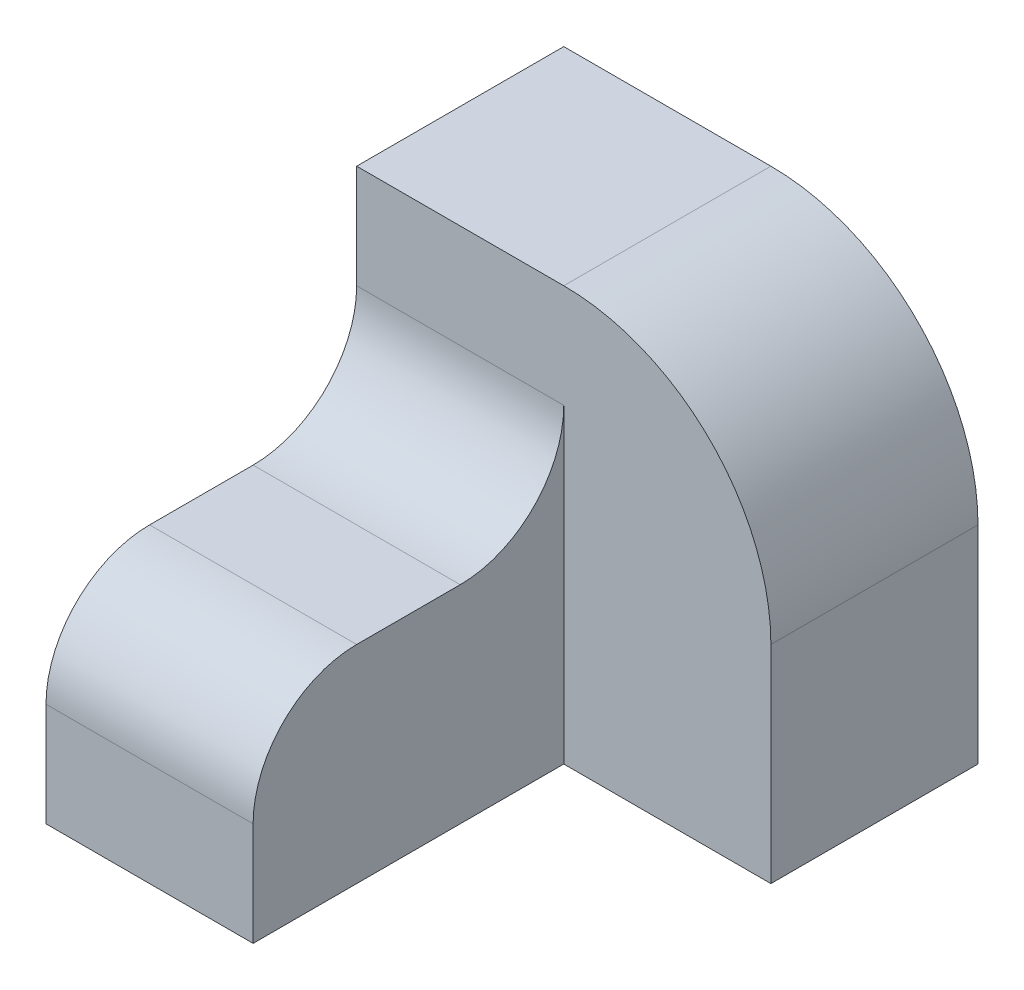
ISO-10303-21;
HEADER;
FILE_DESCRIPTION(('STEP AP214'),'2;1');
FILE_NAME('part.step','',(''),(''),'','','');
FILE_SCHEMA(('AUTOMOTIVE_DESIGN { 1 0 10303 214 1 1 1 1 }'));
ENDSEC;
DATA;
#1=APPLICATION_CONTEXT('core data for automotive mechanical design processes');
#2=APPLICATION_PROTOCOL_DEFINITION('international standard','automotive_design',2000,#1);
#3=PRODUCT_CONTEXT('',#1,'mechanical');
#4=PRODUCT('Part','Part','',(#3));
#5=PRODUCT_RELATED_PRODUCT_CATEGORY('part','',(#4));
#6=PRODUCT_DEFINITION_FORMATION('','',#4);
#7=PRODUCT_DEFINITION_CONTEXT('part definition',#1,'design');
#8=PRODUCT_DEFINITION('design','',#6,#7);
#9=PRODUCT_DEFINITION_SHAPE('','',#8);
#10=(LENGTH_UNIT() NAMED_UNIT(*) SI_UNIT(.MILLI.,.METRE.));
#11=(NAMED_UNIT(*) PLANE_ANGLE_UNIT() SI_UNIT($,.RADIAN.));
#12=(NAMED_UNIT(*) SI_UNIT($,.STERADIAN.) SOLID_ANGLE_UNIT());
#13=UNCERTAINTY_MEASURE_WITH_UNIT(LENGTH_MEASURE(1.E-05),#10,'distance_accuracy_value','');
#14=(GEOMETRIC_REPRESENTATION_CONTEXT(3) GLOBAL_UNCERTAINTY_ASSIGNED_CONTEXT((#13)) GLOBAL_UNIT_ASSIGNED_CONTEXT((#10,
#11,#12)) REPRESENTATION_CONTEXT('',''));
#15=CARTESIAN_POINT('',(0.,0.,0.));
#16=DIRECTION('',(0.,0.,1.));
#17=DIRECTION('',(1.,0.,0.));
#18=AXIS2_PLACEMENT_3D('',#15,#16,#17);
#19=CARTESIAN_POINT('',(20.,-10.,30.));
#20=DIRECTION('',(1.,0.,0.));
#21=DIRECTION('',(0.,0.,-1.));
#22=AXIS2_PLACEMENT_3D('',#19,#20,#21);
#23=PLANE('',#22);
#24=DIRECTION('',(0.,0.,-1.));
#25=VECTOR('',#24,1.);
#26=CARTESIAN_POINT('',(20.,-20.,10.));
#27=LINE('',#26,#25);
#28=CARTESIAN_POINT('',(20.,-20.,40.));
#29=VERTEX_POINT('',#28);
#30=CARTESIAN_POINT('',(20.,-20.,10.));
#31=VERTEX_POINT('',#30);
#32=EDGE_CURVE('E55',#29,#31,#27,.T.);
#33=ORIENTED_EDGE('',*,*,#32,.T.);
#34=DIRECTION('',(0.,1.,0.));
#35=VECTOR('',#34,1.);
#36=CARTESIAN_POINT('',(20.,-20.,10.));
#37=LINE('',#36,#35);
#38=CARTESIAN_POINT('',(20.,10.0000000000001,10.));
#39=VERTEX_POINT('',#38);
#40=EDGE_CURVE('E201',#31,#39,#37,.T.);
#41=ORIENTED_EDGE('',*,*,#40,.T.);
#42=CARTESIAN_POINT('',(20.,10.,20.));
#43=DIRECTION('',(-1.,0.,0.));
#44=DIRECTION('',(0.,0.,1.));
#45=AXIS2_PLACEMENT_3D('',#42,#43,#44);
#46=CIRCLE('',#45,10.);
#47=CARTESIAN_POINT('',(20.,0.,20.0000000000001));
#48=VERTEX_POINT('',#47);
#49=EDGE_CURVE('E118',#39,#48,#46,.T.);
#50=ORIENTED_EDGE('',*,*,#49,.T.);
#51=DIRECTION('',(0.,0.,1.));
#52=VECTOR('',#51,1.);
#53=CARTESIAN_POINT('',(20.,0.,29.9999999999999));
#54=LINE('',#53,#52);
#55=CARTESIAN_POINT('',(20.,0.,29.9999999999999));
#56=VERTEX_POINT('',#55);
#57=EDGE_CURVE('E112',#48,#56,#54,.T.);
#58=ORIENTED_EDGE('',*,*,#57,.T.);
#59=CARTESIAN_POINT('',(20.,-10.,30.));
#60=DIRECTION('',(1.,0.,0.));
#61=DIRECTION('',(0.,0.,-1.));
#62=AXIS2_PLACEMENT_3D('',#59,#60,#61);
#63=CIRCLE('',#62,10.);
#64=CARTESIAN_POINT('',(20.,-10.0000000000001,40.));
#65=VERTEX_POINT('',#64);
#66=EDGE_CURVE('E115',#56,#65,#63,.T.);
#67=ORIENTED_EDGE('',*,*,#66,.T.);
#68=DIRECTION('',(0.,-1.,0.));
#69=VECTOR('',#68,1.);
#70=CARTESIAN_POINT('',(20.,-20.,40.));
#71=LINE('',#70,#69);
#72=EDGE_CURVE('E61',#65,#29,#71,.T.);
#73=ORIENTED_EDGE('',*,*,#72,.T.);
#74=EDGE_LOOP('',(#33,#41,#50,#58,#67,#73));
#75=FACE_BOUND('',#74,.T.);
#76=ADVANCED_FACE('F39',(#75),#23,.T.);
#77=CARTESIAN_POINT('',(20.,20.,-9.99999999999999));
#78=DIRECTION('',(0.,0.,1.));
#79=DIRECTION('',(0.,-1.,0.));
#80=AXIS2_PLACEMENT_3D('',#77,#78,#79);
#81=PLANE('',#80);
#82=DIRECTION('',(0.,1.,0.));
#83=VECTOR('',#82,1.);
#84=CARTESIAN_POINT('',(0.,20.,-9.99999999999999));
#85=LINE('',#84,#83);
#86=CARTESIAN_POINT('',(0.,-20.,-10.));
#87=VERTEX_POINT('',#86);
#88=CARTESIAN_POINT('',(0.,20.,-9.99999999999999));
#89=VERTEX_POINT('',#88);
#90=EDGE_CURVE('E146',#87,#89,#85,.T.);
#91=ORIENTED_EDGE('',*,*,#90,.T.);
#92=DIRECTION('',(-1.,0.,0.));
#93=VECTOR('',#92,1.);
#94=CARTESIAN_POINT('',(20.,20.,-9.99999999999999));
#95=LINE('',#94,#93);
#96=CARTESIAN_POINT('',(20.,20.,-9.99999999999999));
#97=VERTEX_POINT('',#96);
#98=EDGE_CURVE('E11',#97,#89,#95,.T.);
#99=ORIENTED_EDGE('',*,*,#98,.F.);
#100=CARTESIAN_POINT('',(20.,0.,-9.99999999999999));
#101=DIRECTION('',(0.,0.,-1.));
#102=DIRECTION('',(0.,-1.,0.));
#103=AXIS2_PLACEMENT_3D('',#100,#101,#102);
#104=CIRCLE('',#103,20.);
#105=CARTESIAN_POINT('',(40.,-1.43982048506075E-13,-9.99999999999999));
#106=VERTEX_POINT('',#105);
#107=EDGE_CURVE('E215',#97,#106,#104,.T.);
#108=ORIENTED_EDGE('',*,*,#107,.T.);
#109=DIRECTION('',(0.,-1.,0.));
#110=VECTOR('',#109,1.);
#111=CARTESIAN_POINT('',(40.,-1.43982048506075E-13,-9.99999999999999));
#112=LINE('',#111,#110);
#113=CARTESIAN_POINT('',(40.,-20.,-10.));
#114=VERTEX_POINT('',#113);
#115=EDGE_CURVE('E219',#106,#114,#112,.T.);
#116=ORIENTED_EDGE('',*,*,#115,.T.);
#117=DIRECTION('',(-1.,0.,0.));
#118=VECTOR('',#117,1.);
#119=CARTESIAN_POINT('',(20.,-20.,-10.));
#120=LINE('',#119,#118);
#121=EDGE_CURVE('E145',#114,#87,#120,.T.);
#122=ORIENTED_EDGE('',*,*,#121,.T.);
#123=EDGE_LOOP('',(#91,#99,#108,#116,#122));
#124=FACE_BOUND('',#123,.T.);
#125=ADVANCED_FACE('F41',(#124),#81,.F.);
#126=CARTESIAN_POINT('',(20.,20.,10.));
#127=DIRECTION('',(0.,-1.,0.));
#128=DIRECTION('',(0.,0.,-1.));
#129=AXIS2_PLACEMENT_3D('',#126,#127,#128);
#130=PLANE('',#129);
#131=DIRECTION('',(0.,0.,1.));
#132=VECTOR('',#131,1.);
#133=CARTESIAN_POINT('',(0.,20.,10.));
#134=LINE('',#133,#132);
#135=CARTESIAN_POINT('',(0.,20.,10.));
#136=VERTEX_POINT('',#135);
#137=EDGE_CURVE('E150',#89,#136,#134,.T.);
#138=ORIENTED_EDGE('',*,*,#137,.T.);
#139=DIRECTION('',(-1.,0.,0.));
#140=VECTOR('',#139,1.);
#141=CARTESIAN_POINT('',(20.,20.,10.));
#142=LINE('',#141,#140);
#143=CARTESIAN_POINT('',(20.,20.,10.));
#144=VERTEX_POINT('',#143);
#145=EDGE_CURVE('E48',#144,#136,#142,.T.);
#146=ORIENTED_EDGE('',*,*,#145,.F.);
#147=DIRECTION('',(0.,0.,1.));
#148=VECTOR('',#147,1.);
#149=CARTESIAN_POINT('',(20.,20.,10.));
#150=LINE('',#149,#148);
#151=EDGE_CURVE('E102',#97,#144,#150,.T.);
#152=ORIENTED_EDGE('',*,*,#151,.F.);
#153=ORIENTED_EDGE('',*,*,#98,.T.);
#154=EDGE_LOOP('',(#138,#146,#152,#153));
#155=FACE_BOUND('',#154,.T.);
#156=ADVANCED_FACE('F264',(#155),#130,.F.);
#157=CARTESIAN_POINT('',(20.,20.,10.));
#158=DIRECTION('',(0.,0.,-1.));
#159=DIRECTION('',(0.,1.,0.));
#160=AXIS2_PLACEMENT_3D('',#157,#158,#159);
#161=PLANE('',#160);
#162=DIRECTION('',(0.,-1.,0.));
#163=VECTOR('',#162,1.);
#164=CARTESIAN_POINT('',(0.,20.,10.));
#165=LINE('',#164,#163);
#166=CARTESIAN_POINT('',(0.,10.0000000000001,10.));
#167=VERTEX_POINT('',#166);
#168=EDGE_CURVE('E154',#136,#167,#165,.T.);
#169=ORIENTED_EDGE('',*,*,#168,.T.);
#170=DIRECTION('',(-1.,0.,0.));
#171=VECTOR('',#170,1.);
#172=CARTESIAN_POINT('',(20.,10.0000000000001,10.));
#173=LINE('',#172,#171);
#174=EDGE_CURVE('E180',#39,#167,#173,.T.);
#175=ORIENTED_EDGE('',*,*,#174,.F.);
#176=ORIENTED_EDGE('',*,*,#40,.F.);
#177=DIRECTION('',(-1.,0.,0.));
#178=VECTOR('',#177,1.);
#179=CARTESIAN_POINT('',(40.,-20.,10.));
#180=LINE('',#179,#178);
#181=CARTESIAN_POINT('',(40.,-20.,10.));
#182=VERTEX_POINT('',#181);
#183=EDGE_CURVE('E205',#182,#31,#180,.T.);
#184=ORIENTED_EDGE('',*,*,#183,.F.);
#185=DIRECTION('',(0.,-1.,0.));
#186=VECTOR('',#185,1.);
#187=CARTESIAN_POINT('',(40.,-1.47451495458029E-13,10.));
#188=LINE('',#187,#186);
#189=CARTESIAN_POINT('',(40.,-1.47451495458029E-13,10.));
#190=VERTEX_POINT('',#189);
#191=EDGE_CURVE('E211',#190,#182,#188,.T.);
#192=ORIENTED_EDGE('',*,*,#191,.F.);
#193=CARTESIAN_POINT('',(20.,0.,10.));
#194=DIRECTION('',(0.,0.,-1.));
#195=DIRECTION('',(0.,-1.,0.));
#196=AXIS2_PLACEMENT_3D('',#193,#194,#195);
#197=CIRCLE('',#196,20.);
#198=EDGE_CURVE('E192',#144,#190,#197,.T.);
#199=ORIENTED_EDGE('',*,*,#198,.F.);
#200=ORIENTED_EDGE('',*,*,#145,.T.);
#201=EDGE_LOOP('',(#169,#175,#176,#184,#192,#199,#200));
#202=FACE_BOUND('',#201,.T.);
#203=ADVANCED_FACE('F188',(#202),#161,.F.);
#204=CARTESIAN_POINT('',(20.,10.,20.));
#205=DIRECTION('',(-1.,0.,0.));
#206=DIRECTION('',(0.,0.,1.));
#207=AXIS2_PLACEMENT_3D('',#204,#205,#206);
#208=CYLINDRICAL_SURFACE('',#207,10.);
#209=CARTESIAN_POINT('',(0.,10.,20.));
#210=DIRECTION('',(-1.,0.,0.));
#211=DIRECTION('',(0.,0.,1.));
#212=AXIS2_PLACEMENT_3D('',#209,#210,#211);
#213=CIRCLE('',#212,10.);
#214=CARTESIAN_POINT('',(0.,0.,20.0000000000001));
#215=VERTEX_POINT('',#214);
#216=EDGE_CURVE('E157',#167,#215,#213,.T.);
#217=ORIENTED_EDGE('',*,*,#216,.T.);
#218=DIRECTION('',(-1.,0.,0.));
#219=VECTOR('',#218,1.);
#220=CARTESIAN_POINT('',(20.,0.,20.0000000000001));
#221=LINE('',#220,#219);
#222=EDGE_CURVE('E132',#48,#215,#221,.T.);
#223=ORIENTED_EDGE('',*,*,#222,.F.);
#224=ORIENTED_EDGE('',*,*,#49,.F.);
#225=ORIENTED_EDGE('',*,*,#174,.T.);
#226=EDGE_LOOP('',(#217,#223,#224,#225));
#227=FACE_BOUND('',#226,.T.);
#228=ADVANCED_FACE('F198',(#227),#208,.F.);
#229=CARTESIAN_POINT('',(20.,0.,29.9999999999999));
#230=DIRECTION('',(0.,-1.,0.));
#231=DIRECTION('',(0.,0.,-1.));
#232=AXIS2_PLACEMENT_3D('',#229,#230,#231);
#233=PLANE('',#232);
#234=DIRECTION('',(0.,0.,1.));
#235=VECTOR('',#234,1.);
#236=CARTESIAN_POINT('',(0.,0.,29.9999999999999));
#237=LINE('',#236,#235);
#238=CARTESIAN_POINT('',(0.,0.,29.9999999999999));
#239=VERTEX_POINT('',#238);
#240=EDGE_CURVE('E128',#215,#239,#237,.T.);
#241=ORIENTED_EDGE('',*,*,#240,.T.);
#242=DIRECTION('',(-1.,0.,0.));
#243=VECTOR('',#242,1.);
#244=CARTESIAN_POINT('',(20.,0.,29.9999999999999));
#245=LINE('',#244,#243);
#246=EDGE_CURVE('E125',#56,#239,#245,.T.);
#247=ORIENTED_EDGE('',*,*,#246,.F.);
#248=ORIENTED_EDGE('',*,*,#57,.F.);
#249=ORIENTED_EDGE('',*,*,#222,.T.);
#250=EDGE_LOOP('',(#241,#247,#248,#249));
#251=FACE_BOUND('',#250,.T.);
#252=ADVANCED_FACE('F126',(#251),#233,.F.);
#253=CARTESIAN_POINT('',(20.,-10.,30.));
#254=DIRECTION('',(-1.,0.,0.));
#255=DIRECTION('',(0.,0.,1.));
#256=AXIS2_PLACEMENT_3D('',#253,#254,#255);
#257=CYLINDRICAL_SURFACE('',#256,10.);
#258=CARTESIAN_POINT('',(0.,-10.,30.));
#259=DIRECTION('',(1.,0.,0.));
#260=DIRECTION('',(0.,0.,-1.));
#261=AXIS2_PLACEMENT_3D('',#258,#259,#260);
#262=CIRCLE('',#261,10.);
#263=CARTESIAN_POINT('',(0.,-10.0000000000001,40.));
#264=VERTEX_POINT('',#263);
#265=EDGE_CURVE('E162',#239,#264,#262,.T.);
#266=ORIENTED_EDGE('',*,*,#265,.T.);
#267=DIRECTION('',(-1.,0.,0.));
#268=VECTOR('',#267,1.);
#269=CARTESIAN_POINT('',(20.,-10.0000000000001,40.));
#270=LINE('',#269,#268);
#271=EDGE_CURVE('E133',#65,#264,#270,.T.);
#272=ORIENTED_EDGE('',*,*,#271,.F.);
#273=ORIENTED_EDGE('',*,*,#66,.F.);
#274=ORIENTED_EDGE('',*,*,#246,.T.);
#275=EDGE_LOOP('',(#266,#272,#273,#274));
#276=FACE_BOUND('',#275,.T.);
#277=ADVANCED_FACE('F135',(#276),#257,.T.);
#278=CARTESIAN_POINT('',(20.,-20.,40.));
#279=DIRECTION('',(0.,0.,-1.));
#280=DIRECTION('',(-1.,0.,0.));
#281=AXIS2_PLACEMENT_3D('',#278,#279,#280);
#282=PLANE('',#281);
#283=DIRECTION('',(0.,-1.,0.));
#284=VECTOR('',#283,1.);
#285=CARTESIAN_POINT('',(0.,-20.,40.));
#286=LINE('',#285,#284);
#287=CARTESIAN_POINT('',(0.,-20.,40.));
#288=VERTEX_POINT('',#287);
#289=EDGE_CURVE('E165',#264,#288,#286,.T.);
#290=ORIENTED_EDGE('',*,*,#289,.T.);
#291=DIRECTION('',(-1.,0.,0.));
#292=VECTOR('',#291,1.);
#293=CARTESIAN_POINT('',(20.,-20.,40.));
#294=LINE('',#293,#292);
#295=EDGE_CURVE('E173',#29,#288,#294,.T.);
#296=ORIENTED_EDGE('',*,*,#295,.F.);
#297=ORIENTED_EDGE('',*,*,#72,.F.);
#298=ORIENTED_EDGE('',*,*,#271,.T.);
#299=EDGE_LOOP('',(#290,#296,#297,#298));
#300=FACE_BOUND('',#299,.T.);
#301=ADVANCED_FACE('F250',(#300),#282,.F.);
#302=CARTESIAN_POINT('',(20.,-20.,10.));
#303=DIRECTION('',(0.,1.,0.));
#304=DIRECTION('',(0.,0.,1.));
#305=AXIS2_PLACEMENT_3D('',#302,#303,#304);
#306=PLANE('',#305);
#307=DIRECTION('',(0.,0.,-1.));
#308=VECTOR('',#307,1.);
#309=CARTESIAN_POINT('',(0.,-20.,10.));
#310=LINE('',#309,#308);
#311=EDGE_CURVE('E94',#288,#87,#310,.T.);
#312=ORIENTED_EDGE('',*,*,#311,.T.);
#313=ORIENTED_EDGE('',*,*,#121,.F.);
#314=DIRECTION('',(0.,0.,-1.));
#315=VECTOR('',#314,1.);
#316=CARTESIAN_POINT('',(40.,-20.,10.));
#317=LINE('',#316,#315);
#318=EDGE_CURVE('E151',#182,#114,#317,.T.);
#319=ORIENTED_EDGE('',*,*,#318,.F.);
#320=ORIENTED_EDGE('',*,*,#183,.T.);
#321=ORIENTED_EDGE('',*,*,#32,.F.);
#322=ORIENTED_EDGE('',*,*,#295,.T.);
#323=EDGE_LOOP('',(#312,#313,#319,#320,#321,#322));
#324=FACE_BOUND('',#323,.T.);
#325=ADVANCED_FACE('F247',(#324),#306,.F.);
#326=CARTESIAN_POINT('',(0.,-10.,30.));
#327=DIRECTION('',(1.,0.,0.));
#328=DIRECTION('',(0.,0.,-1.));
#329=AXIS2_PLACEMENT_3D('',#326,#327,#328);
#330=PLANE('',#329);
#331=ORIENTED_EDGE('',*,*,#90,.F.);
#332=ORIENTED_EDGE('',*,*,#311,.F.);
#333=ORIENTED_EDGE('',*,*,#289,.F.);
#334=ORIENTED_EDGE('',*,*,#265,.F.);
#335=ORIENTED_EDGE('',*,*,#240,.F.);
#336=ORIENTED_EDGE('',*,*,#216,.F.);
#337=ORIENTED_EDGE('',*,*,#168,.F.);
#338=ORIENTED_EDGE('',*,*,#137,.F.);
#339=EDGE_LOOP('',(#331,#332,#333,#334,#335,#336,#337,#338));
#340=FACE_BOUND('',#339,.T.);
#341=ADVANCED_FACE('F196',(#340),#330,.F.);
#342=CARTESIAN_POINT('',(20.,0.,10.));
#343=DIRECTION('',(0.,0.,-1.));
#344=DIRECTION('',(0.,1.,0.));
#345=AXIS2_PLACEMENT_3D('',#342,#343,#344);
#346=CYLINDRICAL_SURFACE('',#345,20.);
#347=ORIENTED_EDGE('',*,*,#107,.F.);
#348=ORIENTED_EDGE('',*,*,#151,.T.);
#349=ORIENTED_EDGE('',*,*,#198,.T.);
#350=DIRECTION('',(0.,0.,-1.));
#351=VECTOR('',#350,1.);
#352=CARTESIAN_POINT('',(40.,-1.47451495458029E-13,10.));
#353=LINE('',#352,#351);
#354=EDGE_CURVE('E204',#190,#106,#353,.T.);
#355=ORIENTED_EDGE('',*,*,#354,.T.);
#356=EDGE_LOOP('',(#347,#348,#349,#355));
#357=FACE_BOUND('',#356,.T.);
#358=ADVANCED_FACE('F230',(#357),#346,.T.);
#359=CARTESIAN_POINT('',(40.,-1.47451495458029E-13,10.));
#360=DIRECTION('',(1.,0.,0.));
#361=DIRECTION('',(0.,0.,-1.));
#362=AXIS2_PLACEMENT_3D('',#359,#360,#361);
#363=PLANE('',#362);
#364=ORIENTED_EDGE('',*,*,#115,.F.);
#365=ORIENTED_EDGE('',*,*,#354,.F.);
#366=ORIENTED_EDGE('',*,*,#191,.T.);
#367=ORIENTED_EDGE('',*,*,#318,.T.);
#368=EDGE_LOOP('',(#364,#365,#366,#367));
#369=FACE_BOUND('',#368,.T.);
#370=ADVANCED_FACE('F243',(#369),#363,.T.);
#371=CLOSED_SHELL('',(#76,#125,#156,#203,#228,#252,#277,#301,#325,#341,#358,#370));
#372=MANIFOLD_SOLID_BREP('B2',#371);
#373=ADVANCED_BREP_SHAPE_REPRESENTATION('',(#18,#372),#14);
#374=SHAPE_DEFINITION_REPRESENTATION(#9,#373);
ENDSEC;
END-ISO-10303-21;
